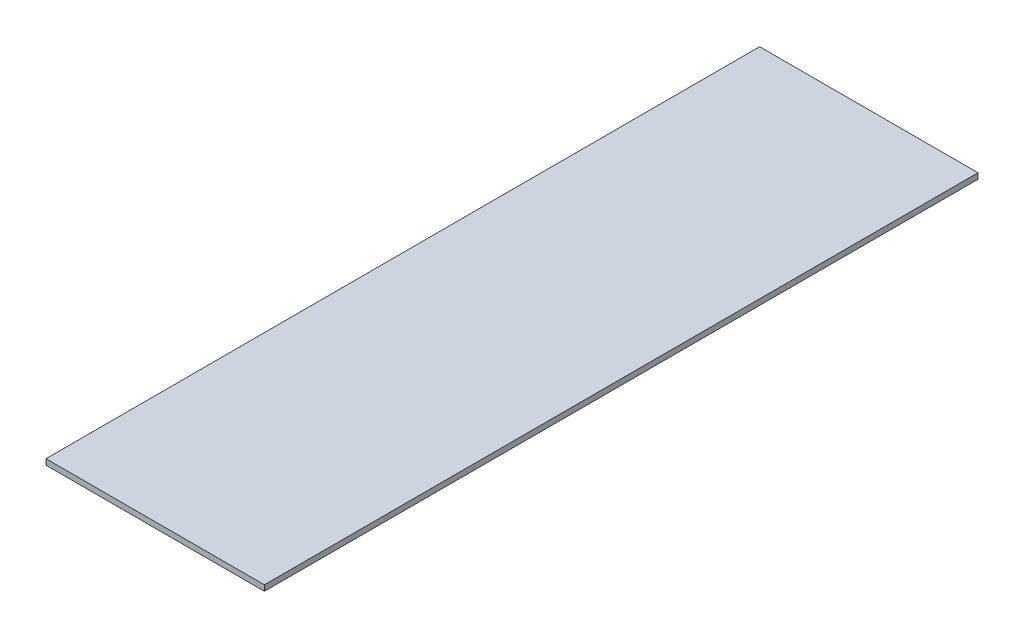
ISO-10303-21;
HEADER;
FILE_DESCRIPTION(('STEP AP214'),'2;1');
FILE_NAME('part.step','',(''),(''),'','','');
FILE_SCHEMA(('AUTOMOTIVE_DESIGN { 1 0 10303 214 1 1 1 1 }'));
ENDSEC;
DATA;
#1=APPLICATION_CONTEXT('core data for automotive mechanical design processes');
#2=APPLICATION_PROTOCOL_DEFINITION('international standard','automotive_design',2000,#1);
#3=PRODUCT_CONTEXT('',#1,'mechanical');
#4=PRODUCT('Part','Part','',(#3));
#5=PRODUCT_RELATED_PRODUCT_CATEGORY('part','',(#4));
#6=PRODUCT_DEFINITION_FORMATION('','',#4);
#7=PRODUCT_DEFINITION_CONTEXT('part definition',#1,'design');
#8=PRODUCT_DEFINITION('design','',#6,#7);
#9=PRODUCT_DEFINITION_SHAPE('','',#8);
#10=(LENGTH_UNIT() NAMED_UNIT(*) SI_UNIT(.MILLI.,.METRE.));
#11=(NAMED_UNIT(*) PLANE_ANGLE_UNIT() SI_UNIT($,.RADIAN.));
#12=(NAMED_UNIT(*) SI_UNIT($,.STERADIAN.) SOLID_ANGLE_UNIT());
#13=UNCERTAINTY_MEASURE_WITH_UNIT(LENGTH_MEASURE(1.E-05),#10,'distance_accuracy_value','');
#14=(GEOMETRIC_REPRESENTATION_CONTEXT(3) GLOBAL_UNCERTAINTY_ASSIGNED_CONTEXT((#13)) GLOBAL_UNIT_ASSIGNED_CONTEXT((#10,
#11,#12)) REPRESENTATION_CONTEXT('',''));
#15=CARTESIAN_POINT('',(0.,0.,0.));
#16=DIRECTION('',(0.,0.,1.));
#17=DIRECTION('',(1.,0.,0.));
#18=AXIS2_PLACEMENT_3D('',#15,#16,#17);
#19=CARTESIAN_POINT('',(-87.06,4.5,-284.5));
#20=DIRECTION('',(1.,0.,0.));
#21=DIRECTION('',(0.,0.,-1.));
#22=AXIS2_PLACEMENT_3D('',#19,#20,#21);
#23=PLANE('',#22);
#24=DIRECTION('',(0.,0.,1.));
#25=VECTOR('',#24,1.);
#26=CARTESIAN_POINT('',(-87.06,0.,-284.5));
#27=LINE('',#26,#25);
#28=CARTESIAN_POINT('',(-87.06,0.,-284.5));
#29=VERTEX_POINT('',#28);
#30=CARTESIAN_POINT('',(-87.06,0.,284.5));
#31=VERTEX_POINT('',#30);
#32=EDGE_CURVE('E107',#29,#31,#27,.T.);
#33=ORIENTED_EDGE('',*,*,#32,.T.);
#34=DIRECTION('',(0.,-1.,0.));
#35=VECTOR('',#34,1.);
#36=CARTESIAN_POINT('',(-87.06,4.5,284.5));
#37=LINE('',#36,#35);
#38=CARTESIAN_POINT('',(-87.06,4.5,284.5));
#39=VERTEX_POINT('',#38);
#40=EDGE_CURVE('E11',#39,#31,#37,.T.);
#41=ORIENTED_EDGE('',*,*,#40,.F.);
#42=DIRECTION('',(0.,0.,1.));
#43=VECTOR('',#42,1.);
#44=CARTESIAN_POINT('',(-87.06,4.5,-284.5));
#45=LINE('',#44,#43);
#46=CARTESIAN_POINT('',(-87.06,4.5,-284.5));
#47=VERTEX_POINT('',#46);
#48=EDGE_CURVE('E91',#47,#39,#45,.T.);
#49=ORIENTED_EDGE('',*,*,#48,.F.);
#50=DIRECTION('',(0.,-1.,0.));
#51=VECTOR('',#50,1.);
#52=CARTESIAN_POINT('',(-87.06,4.5,-284.5));
#53=LINE('',#52,#51);
#54=EDGE_CURVE('E103',#47,#29,#53,.T.);
#55=ORIENTED_EDGE('',*,*,#54,.T.);
#56=EDGE_LOOP('',(#33,#41,#49,#55));
#57=FACE_BOUND('',#56,.T.);
#58=ADVANCED_FACE('F39',(#57),#23,.F.);
#59=CARTESIAN_POINT('',(-87.06,4.5,284.5));
#60=DIRECTION('',(0.,0.,-1.));
#61=DIRECTION('',(-1.,0.,0.));
#62=AXIS2_PLACEMENT_3D('',#59,#60,#61);
#63=PLANE('',#62);
#64=DIRECTION('',(1.,0.,0.));
#65=VECTOR('',#64,1.);
#66=CARTESIAN_POINT('',(-87.06,0.,284.5));
#67=LINE('',#66,#65);
#68=CARTESIAN_POINT('',(87.06,0.,284.5));
#69=VERTEX_POINT('',#68);
#70=EDGE_CURVE('E96',#31,#69,#67,.T.);
#71=ORIENTED_EDGE('',*,*,#70,.T.);
#72=DIRECTION('',(0.,-1.,0.));
#73=VECTOR('',#72,1.);
#74=CARTESIAN_POINT('',(87.06,4.5,284.5));
#75=LINE('',#74,#73);
#76=CARTESIAN_POINT('',(87.06,4.5,284.5));
#77=VERTEX_POINT('',#76);
#78=EDGE_CURVE('E48',#77,#69,#75,.T.);
#79=ORIENTED_EDGE('',*,*,#78,.F.);
#80=DIRECTION('',(1.,0.,0.));
#81=VECTOR('',#80,1.);
#82=CARTESIAN_POINT('',(-87.06,4.5,284.5));
#83=LINE('',#82,#81);
#84=EDGE_CURVE('E86',#39,#77,#83,.T.);
#85=ORIENTED_EDGE('',*,*,#84,.F.);
#86=ORIENTED_EDGE('',*,*,#40,.T.);
#87=EDGE_LOOP('',(#71,#79,#85,#86));
#88=FACE_BOUND('',#87,.T.);
#89=ADVANCED_FACE('F95',(#88),#63,.F.);
#90=CARTESIAN_POINT('',(87.06,4.5,-284.5));
#91=DIRECTION('',(-1.,0.,0.));
#92=DIRECTION('',(0.,0.,1.));
#93=AXIS2_PLACEMENT_3D('',#90,#91,#92);
#94=PLANE('',#93);
#95=DIRECTION('',(0.,0.,-1.));
#96=VECTOR('',#95,1.);
#97=CARTESIAN_POINT('',(87.06,0.,-284.5));
#98=LINE('',#97,#96);
#99=CARTESIAN_POINT('',(87.06,0.,-284.5));
#100=VERTEX_POINT('',#99);
#101=EDGE_CURVE('E73',#69,#100,#98,.T.);
#102=ORIENTED_EDGE('',*,*,#101,.T.);
#103=DIRECTION('',(0.,-1.,0.));
#104=VECTOR('',#103,1.);
#105=CARTESIAN_POINT('',(87.06,4.5,-284.5));
#106=LINE('',#105,#104);
#107=CARTESIAN_POINT('',(87.06,4.5,-284.5));
#108=VERTEX_POINT('',#107);
#109=EDGE_CURVE('E98',#108,#100,#106,.T.);
#110=ORIENTED_EDGE('',*,*,#109,.F.);
#111=DIRECTION('',(0.,0.,-1.));
#112=VECTOR('',#111,1.);
#113=CARTESIAN_POINT('',(87.06,4.5,-284.5));
#114=LINE('',#113,#112);
#115=EDGE_CURVE('E89',#77,#108,#114,.T.);
#116=ORIENTED_EDGE('',*,*,#115,.F.);
#117=ORIENTED_EDGE('',*,*,#78,.T.);
#118=EDGE_LOOP('',(#102,#110,#116,#117));
#119=FACE_BOUND('',#118,.T.);
#120=ADVANCED_FACE('F99',(#119),#94,.F.);
#121=CARTESIAN_POINT('',(-87.06,4.5,-284.5));
#122=DIRECTION('',(0.,0.,1.));
#123=DIRECTION('',(1.,0.,0.));
#124=AXIS2_PLACEMENT_3D('',#121,#122,#123);
#125=PLANE('',#124);
#126=DIRECTION('',(-1.,0.,0.));
#127=VECTOR('',#126,1.);
#128=CARTESIAN_POINT('',(-87.06,0.,-284.5));
#129=LINE('',#128,#127);
#130=EDGE_CURVE('E79',#100,#29,#129,.T.);
#131=ORIENTED_EDGE('',*,*,#130,.T.);
#132=ORIENTED_EDGE('',*,*,#54,.F.);
#133=DIRECTION('',(-1.,0.,0.));
#134=VECTOR('',#133,1.);
#135=CARTESIAN_POINT('',(-87.06,4.5,-284.5));
#136=LINE('',#135,#134);
#137=EDGE_CURVE('E56',#108,#47,#136,.T.);
#138=ORIENTED_EDGE('',*,*,#137,.F.);
#139=ORIENTED_EDGE('',*,*,#109,.T.);
#140=EDGE_LOOP('',(#131,#132,#138,#139));
#141=FACE_BOUND('',#140,.T.);
#142=ADVANCED_FACE('F120',(#141),#125,.F.);
#143=CARTESIAN_POINT('',(0.,4.5,0.));
#144=DIRECTION('',(0.,1.,0.));
#145=DIRECTION('',(0.,0.,1.));
#146=AXIS2_PLACEMENT_3D('',#143,#144,#145);
#147=PLANE('',#146);
#148=ORIENTED_EDGE('',*,*,#48,.T.);
#149=ORIENTED_EDGE('',*,*,#84,.T.);
#150=ORIENTED_EDGE('',*,*,#115,.T.);
#151=ORIENTED_EDGE('',*,*,#137,.T.);
#152=EDGE_LOOP('',(#148,#149,#150,#151));
#153=FACE_BOUND('',#152,.T.);
#154=ADVANCED_FACE('F87',(#153),#147,.T.);
#155=CARTESIAN_POINT('',(0.,0.,0.));
#156=DIRECTION('',(0.,1.,0.));
#157=DIRECTION('',(0.,0.,1.));
#158=AXIS2_PLACEMENT_3D('',#155,#156,#157);
#159=PLANE('',#158);
#160=ORIENTED_EDGE('',*,*,#32,.F.);
#161=ORIENTED_EDGE('',*,*,#130,.F.);
#162=ORIENTED_EDGE('',*,*,#101,.F.);
#163=ORIENTED_EDGE('',*,*,#70,.F.);
#164=EDGE_LOOP('',(#160,#161,#162,#163));
#165=FACE_BOUND('',#164,.T.);
#166=ADVANCED_FACE('F123',(#165),#159,.F.);
#167=CLOSED_SHELL('',(#58,#89,#120,#142,#154,#166));
#168=MANIFOLD_SOLID_BREP('B2',#167);
#169=ADVANCED_BREP_SHAPE_REPRESENTATION('',(#18,#168),#14);
#170=SHAPE_DEFINITION_REPRESENTATION(#9,#169);
ENDSEC;
END-ISO-10303-21;
